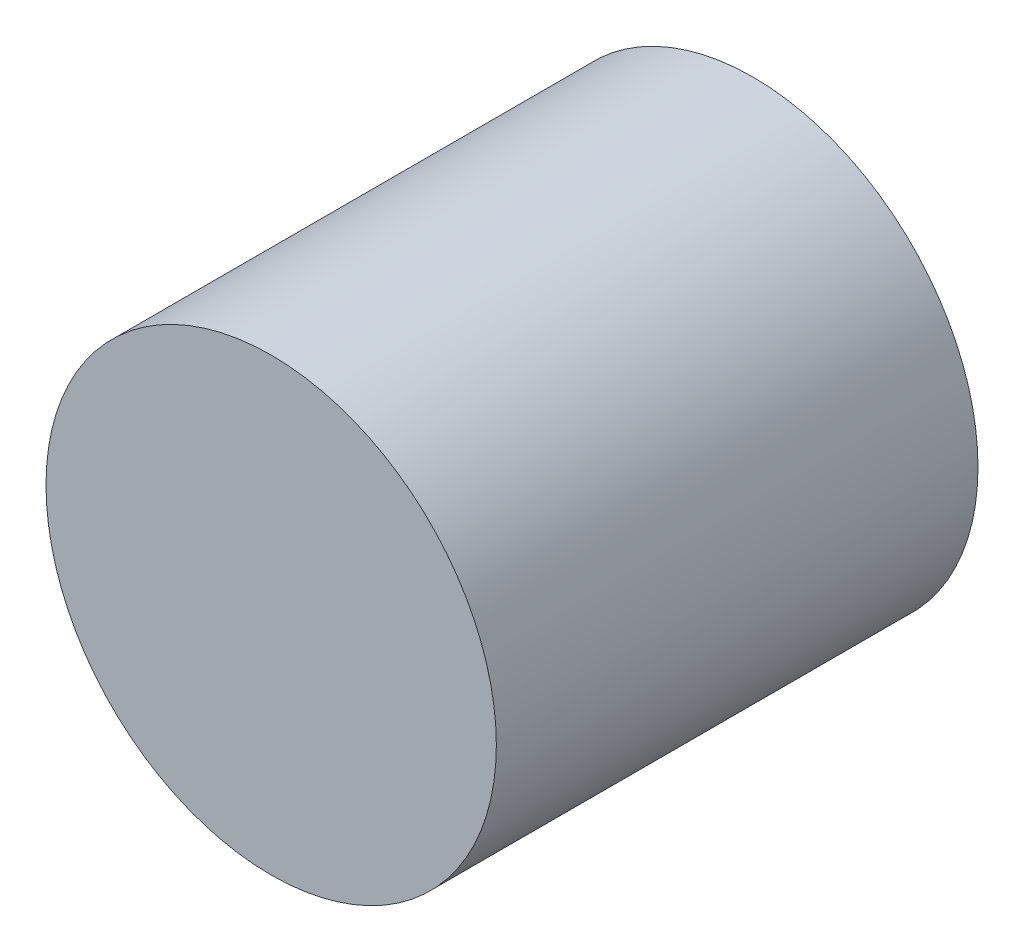
ISO-10303-21;
HEADER;
FILE_DESCRIPTION(('STEP AP214'),'2;1');
FILE_NAME('part.step','',(''),(''),'','','');
FILE_SCHEMA(('AUTOMOTIVE_DESIGN { 1 0 10303 214 1 1 1 1 }'));
ENDSEC;
DATA;
#1=APPLICATION_CONTEXT('core data for automotive mechanical design processes');
#2=APPLICATION_PROTOCOL_DEFINITION('international standard','automotive_design',2000,#1);
#3=PRODUCT_CONTEXT('',#1,'mechanical');
#4=PRODUCT('Part','Part','',(#3));
#5=PRODUCT_RELATED_PRODUCT_CATEGORY('part','',(#4));
#6=PRODUCT_DEFINITION_FORMATION('','',#4);
#7=PRODUCT_DEFINITION_CONTEXT('part definition',#1,'design');
#8=PRODUCT_DEFINITION('design','',#6,#7);
#9=PRODUCT_DEFINITION_SHAPE('','',#8);
#10=(LENGTH_UNIT() NAMED_UNIT(*) SI_UNIT(.MILLI.,.METRE.));
#11=(NAMED_UNIT(*) PLANE_ANGLE_UNIT() SI_UNIT($,.RADIAN.));
#12=(NAMED_UNIT(*) SI_UNIT($,.STERADIAN.) SOLID_ANGLE_UNIT());
#13=UNCERTAINTY_MEASURE_WITH_UNIT(LENGTH_MEASURE(1.E-05),#10,'distance_accuracy_value','');
#14=(GEOMETRIC_REPRESENTATION_CONTEXT(3) GLOBAL_UNCERTAINTY_ASSIGNED_CONTEXT((#13)) GLOBAL_UNIT_ASSIGNED_CONTEXT((#10,
#11,#12)) REPRESENTATION_CONTEXT('',''));
#15=CARTESIAN_POINT('',(0.,0.,0.));
#16=DIRECTION('',(0.,0.,1.));
#17=DIRECTION('',(1.,0.,0.));
#18=AXIS2_PLACEMENT_3D('',#15,#16,#17);
#19=CARTESIAN_POINT('',(0.,0.,50.8));
#20=DIRECTION('',(0.,0.,-1.));
#21=DIRECTION('',(-1.,0.,0.));
#22=AXIS2_PLACEMENT_3D('',#19,#20,#21);
#23=CYLINDRICAL_SURFACE('',#22,23.749);
#24=CARTESIAN_POINT('',(0.,0.,50.8));
#25=DIRECTION('',(0.,0.,1.));
#26=DIRECTION('',(1.,0.,0.));
#27=AXIS2_PLACEMENT_3D('',#24,#25,#26);
#28=CIRCLE('',#27,23.749);
#29=CARTESIAN_POINT('',(23.749,0.,50.8));
#30=VERTEX_POINT('',#29);
#31=EDGE_CURVE('E10',#30,#30,#28,.T.);
#32=ORIENTED_EDGE('',*,*,#31,.F.);
#33=EDGE_LOOP('',(#32));
#34=FACE_BOUND('',#33,.T.);
#35=CARTESIAN_POINT('',(0.,0.,0.));
#36=DIRECTION('',(0.,0.,1.));
#37=DIRECTION('',(1.,0.,0.));
#38=AXIS2_PLACEMENT_3D('',#35,#36,#37);
#39=CIRCLE('',#38,23.749);
#40=CARTESIAN_POINT('',(23.749,0.,0.));
#41=VERTEX_POINT('',#40);
#42=EDGE_CURVE('E40',#41,#41,#39,.T.);
#43=ORIENTED_EDGE('',*,*,#42,.T.);
#44=EDGE_LOOP('',(#43));
#45=FACE_BOUND('',#44,.T.);
#46=ADVANCED_FACE('F37',(#34,#45),#23,.T.);
#47=CARTESIAN_POINT('',(0.,0.,50.8));
#48=DIRECTION('',(0.,0.,1.));
#49=DIRECTION('',(1.,0.,0.));
#50=AXIS2_PLACEMENT_3D('',#47,#48,#49);
#51=PLANE('',#50);
#52=ORIENTED_EDGE('',*,*,#31,.T.);
#53=EDGE_LOOP('',(#52));
#54=FACE_BOUND('',#53,.T.);
#55=ADVANCED_FACE('F54',(#54),#51,.T.);
#56=CARTESIAN_POINT('',(0.,0.,0.));
#57=DIRECTION('',(0.,0.,1.));
#58=DIRECTION('',(1.,0.,0.));
#59=AXIS2_PLACEMENT_3D('',#56,#57,#58);
#60=PLANE('',#59);
#61=ORIENTED_EDGE('',*,*,#42,.F.);
#62=EDGE_LOOP('',(#61));
#63=FACE_BOUND('',#62,.T.);
#64=ADVANCED_FACE('F52',(#63),#60,.F.);
#65=CLOSED_SHELL('',(#46,#55,#64));
#66=MANIFOLD_SOLID_BREP('B2',#65);
#67=ADVANCED_BREP_SHAPE_REPRESENTATION('',(#18,#66),#14);
#68=SHAPE_DEFINITION_REPRESENTATION(#9,#67);
ENDSEC;
END-ISO-10303-21;
